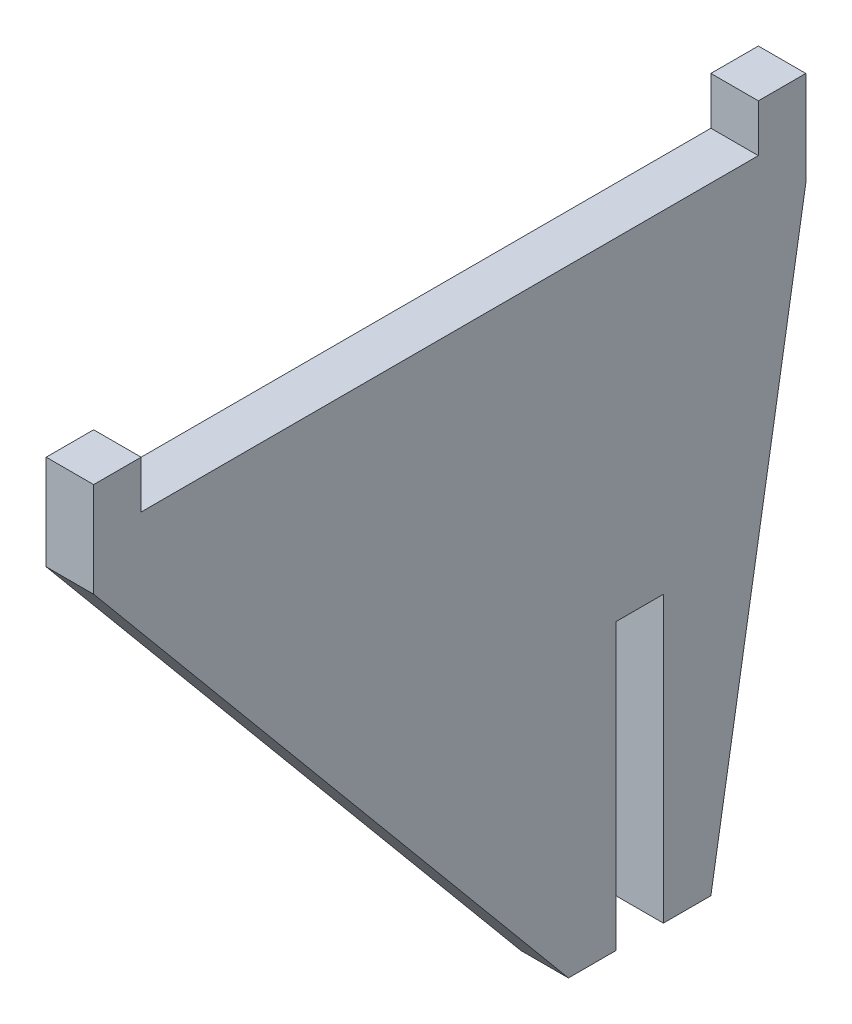
ISO-10303-21;
HEADER;
FILE_DESCRIPTION(('STEP AP214'),'2;1');
FILE_NAME('part.step','',(''),(''),'','','');
FILE_SCHEMA(('AUTOMOTIVE_DESIGN { 1 0 10303 214 1 1 1 1 }'));
ENDSEC;
DATA;
#1=APPLICATION_CONTEXT('core data for automotive mechanical design processes');
#2=APPLICATION_PROTOCOL_DEFINITION('international standard','automotive_design',2000,#1);
#3=PRODUCT_CONTEXT('',#1,'mechanical');
#4=PRODUCT('Part','Part','',(#3));
#5=PRODUCT_RELATED_PRODUCT_CATEGORY('part','',(#4));
#6=PRODUCT_DEFINITION_FORMATION('','',#4);
#7=PRODUCT_DEFINITION_CONTEXT('part definition',#1,'design');
#8=PRODUCT_DEFINITION('design','',#6,#7);
#9=PRODUCT_DEFINITION_SHAPE('','',#8);
#10=(LENGTH_UNIT() NAMED_UNIT(*) SI_UNIT(.MILLI.,.METRE.));
#11=(NAMED_UNIT(*) PLANE_ANGLE_UNIT() SI_UNIT($,.RADIAN.));
#12=(NAMED_UNIT(*) SI_UNIT($,.STERADIAN.) SOLID_ANGLE_UNIT());
#13=UNCERTAINTY_MEASURE_WITH_UNIT(LENGTH_MEASURE(1.E-05),#10,'distance_accuracy_value','');
#14=(GEOMETRIC_REPRESENTATION_CONTEXT(3) GLOBAL_UNCERTAINTY_ASSIGNED_CONTEXT((#13)) GLOBAL_UNIT_ASSIGNED_CONTEXT((#10,
#11,#12)) REPRESENTATION_CONTEXT('',''));
#15=CARTESIAN_POINT('',(0.,0.,0.));
#16=DIRECTION('',(0.,0.,1.));
#17=DIRECTION('',(1.,0.,0.));
#18=AXIS2_PLACEMENT_3D('',#15,#16,#17);
#19=CARTESIAN_POINT('',(-148.470606325174,596.899999999999,799.611357683752));
#20=DIRECTION('',(0.,0.,-1.));
#21=DIRECTION('',(-1.,0.,0.));
#22=AXIS2_PLACEMENT_3D('',#19,#20,#21);
#23=PLANE('',#22);
#24=DIRECTION('',(0.,-1.,0.));
#25=VECTOR('',#24,1.);
#26=CARTESIAN_POINT('',(-161.170606325166,596.899999999999,799.611357683752));
#27=LINE('',#26,#25);
#28=CARTESIAN_POINT('',(-161.170606325166,609.599999999999,799.611357683752));
#29=VERTEX_POINT('',#28);
#30=CARTESIAN_POINT('',(-161.170606325166,584.200000000007,799.611357683752));
#31=VERTEX_POINT('',#30);
#32=EDGE_CURVE('E111',#29,#31,#27,.T.);
#33=ORIENTED_EDGE('',*,*,#32,.T.);
#34=DIRECTION('',(-1.,0.,0.));
#35=VECTOR('',#34,1.);
#36=CARTESIAN_POINT('',(-148.470606325174,584.200000000007,799.611357683752));
#37=LINE('',#36,#35);
#38=CARTESIAN_POINT('',(-148.470606325174,584.200000000007,799.611357683752));
#39=VERTEX_POINT('',#38);
#40=EDGE_CURVE('E11',#39,#31,#37,.T.);
#41=ORIENTED_EDGE('',*,*,#40,.F.);
#42=DIRECTION('',(0.,-1.,0.));
#43=VECTOR('',#42,1.);
#44=CARTESIAN_POINT('',(-148.470606325174,609.599999999999,799.611357683752));
#45=LINE('',#44,#43);
#46=CARTESIAN_POINT('',(-148.470606325174,609.599999999999,799.611357683752));
#47=VERTEX_POINT('',#46);
#48=EDGE_CURVE('E117',#47,#39,#45,.T.);
#49=ORIENTED_EDGE('',*,*,#48,.F.);
#50=DIRECTION('',(-1.,0.,0.));
#51=VECTOR('',#50,1.);
#52=CARTESIAN_POINT('',(-148.470606325174,609.599999999999,799.611357683752));
#53=LINE('',#52,#51);
#54=EDGE_CURVE('E169',#47,#29,#53,.T.);
#55=ORIENTED_EDGE('',*,*,#54,.T.);
#56=EDGE_LOOP('',(#33,#41,#49,#55));
#57=FACE_BOUND('',#56,.T.);
#58=ADVANCED_FACE('F41',(#57),#23,.F.);
#59=CARTESIAN_POINT('',(-148.470606325174,431.800000000007,672.61135768373));
#60=DIRECTION('',(0.,0.640184399664544,-0.768221279597322));
#61=DIRECTION('',(0.,0.768221279597322,0.640184399664544));
#62=AXIS2_PLACEMENT_3D('',#59,#60,#61);
#63=PLANE('',#62);
#64=DIRECTION('',(0.,-0.768221279597322,-0.640184399664544));
#65=VECTOR('',#64,1.);
#66=CARTESIAN_POINT('',(-161.170606325166,431.800000000007,672.61135768373));
#67=LINE('',#66,#65);
#68=CARTESIAN_POINT('',(-161.170606325166,431.800000000007,672.61135768373));
#69=VERTEX_POINT('',#68);
#70=EDGE_CURVE('E174',#31,#69,#67,.T.);
#71=ORIENTED_EDGE('',*,*,#70,.T.);
#72=DIRECTION('',(-1.,0.,0.));
#73=VECTOR('',#72,1.);
#74=CARTESIAN_POINT('',(-148.470606325174,431.800000000007,672.61135768373));
#75=LINE('',#74,#73);
#76=CARTESIAN_POINT('',(-148.470606325174,431.800000000007,672.61135768373));
#77=VERTEX_POINT('',#76);
#78=EDGE_CURVE('E49',#77,#69,#75,.T.);
#79=ORIENTED_EDGE('',*,*,#78,.F.);
#80=DIRECTION('',(0.,-0.768221279597322,-0.640184399664544));
#81=VECTOR('',#80,1.);
#82=CARTESIAN_POINT('',(-148.470606325174,431.800000000007,672.61135768373));
#83=LINE('',#82,#81);
#84=EDGE_CURVE('E277',#39,#77,#83,.T.);
#85=ORIENTED_EDGE('',*,*,#84,.F.);
#86=ORIENTED_EDGE('',*,*,#40,.T.);
#87=EDGE_LOOP('',(#71,#79,#85,#86));
#88=FACE_BOUND('',#87,.T.);
#89=ADVANCED_FACE('F280',(#88),#63,.F.);
#90=CARTESIAN_POINT('',(-148.470606325174,431.800000000007,659.911357683742));
#91=DIRECTION('',(0.,1.,0.));
#92=DIRECTION('',(-1.,0.,0.));
#93=AXIS2_PLACEMENT_3D('',#90,#91,#92);
#94=PLANE('',#93);
#95=DIRECTION('',(0.,0.,-1.));
#96=VECTOR('',#95,1.);
#97=CARTESIAN_POINT('',(-161.170606325166,431.800000000007,659.911357683742));
#98=LINE('',#97,#96);
#99=CARTESIAN_POINT('',(-161.170606325166,431.800000000007,659.911357683742));
#100=VERTEX_POINT('',#99);
#101=EDGE_CURVE('E176',#69,#100,#98,.T.);
#102=ORIENTED_EDGE('',*,*,#101,.T.);
#103=DIRECTION('',(-1.,0.,0.));
#104=VECTOR('',#103,1.);
#105=CARTESIAN_POINT('',(-148.470606325174,431.800000000007,659.911357683742));
#106=LINE('',#105,#104);
#107=CARTESIAN_POINT('',(-148.470606325174,431.800000000007,659.911357683742));
#108=VERTEX_POINT('',#107);
#109=EDGE_CURVE('E224',#108,#100,#106,.T.);
#110=ORIENTED_EDGE('',*,*,#109,.F.);
#111=DIRECTION('',(0.,0.,-1.));
#112=VECTOR('',#111,1.);
#113=CARTESIAN_POINT('',(-148.470606325174,431.800000000007,659.911357683742));
#114=LINE('',#113,#112);
#115=EDGE_CURVE('E233',#77,#108,#114,.T.);
#116=ORIENTED_EDGE('',*,*,#115,.F.);
#117=ORIENTED_EDGE('',*,*,#78,.T.);
#118=EDGE_LOOP('',(#102,#110,#116,#117));
#119=FACE_BOUND('',#118,.T.);
#120=ADVANCED_FACE('F231',(#119),#94,.F.);
#121=CARTESIAN_POINT('',(-148.470606325174,508.000000000007,659.911357683742));
#122=DIRECTION('',(0.,0.,1.));
#123=DIRECTION('',(1.,0.,0.));
#124=AXIS2_PLACEMENT_3D('',#121,#122,#123);
#125=PLANE('',#124);
#126=DIRECTION('',(0.,1.,0.));
#127=VECTOR('',#126,1.);
#128=CARTESIAN_POINT('',(-161.170606325166,508.000000000007,659.911357683742));
#129=LINE('',#128,#127);
#130=CARTESIAN_POINT('',(-161.170606325166,508.000000000007,659.911357683742));
#131=VERTEX_POINT('',#130);
#132=EDGE_CURVE('E178',#100,#131,#129,.T.);
#133=ORIENTED_EDGE('',*,*,#132,.T.);
#134=DIRECTION('',(-1.,0.,0.));
#135=VECTOR('',#134,1.);
#136=CARTESIAN_POINT('',(-148.470606325174,508.000000000007,659.911357683742));
#137=LINE('',#136,#135);
#138=CARTESIAN_POINT('',(-148.470606325174,508.000000000007,659.911357683742));
#139=VERTEX_POINT('',#138);
#140=EDGE_CURVE('E221',#139,#131,#137,.T.);
#141=ORIENTED_EDGE('',*,*,#140,.F.);
#142=DIRECTION('',(0.,1.,0.));
#143=VECTOR('',#142,1.);
#144=CARTESIAN_POINT('',(-148.470606325174,508.000000000007,659.911357683742));
#145=LINE('',#144,#143);
#146=EDGE_CURVE('E251',#108,#139,#145,.T.);
#147=ORIENTED_EDGE('',*,*,#146,.F.);
#148=ORIENTED_EDGE('',*,*,#109,.T.);
#149=EDGE_LOOP('',(#133,#141,#147,#148));
#150=FACE_BOUND('',#149,.T.);
#151=ADVANCED_FACE('F242',(#150),#125,.F.);
#152=CARTESIAN_POINT('',(-148.470606325174,508.000000000007,647.211357683746));
#153=DIRECTION('',(0.,1.,0.));
#154=DIRECTION('',(-1.,0.,0.));
#155=AXIS2_PLACEMENT_3D('',#152,#153,#154);
#156=PLANE('',#155);
#157=DIRECTION('',(0.,0.,-1.));
#158=VECTOR('',#157,1.);
#159=CARTESIAN_POINT('',(-161.170606325166,508.000000000007,647.211357683746));
#160=LINE('',#159,#158);
#161=CARTESIAN_POINT('',(-161.170606325166,508.000000000007,647.211357683746));
#162=VERTEX_POINT('',#161);
#163=EDGE_CURVE('E180',#131,#162,#160,.T.);
#164=ORIENTED_EDGE('',*,*,#163,.T.);
#165=DIRECTION('',(-1.,0.,0.));
#166=VECTOR('',#165,1.);
#167=CARTESIAN_POINT('',(-148.470606325174,508.000000000007,647.211357683746));
#168=LINE('',#167,#166);
#169=CARTESIAN_POINT('',(-148.470606325174,508.000000000007,647.211357683746));
#170=VERTEX_POINT('',#169);
#171=EDGE_CURVE('E218',#170,#162,#168,.T.);
#172=ORIENTED_EDGE('',*,*,#171,.F.);
#173=DIRECTION('',(0.,0.,-1.));
#174=VECTOR('',#173,1.);
#175=CARTESIAN_POINT('',(-148.470606325174,508.000000000007,647.211357683746));
#176=LINE('',#175,#174);
#177=EDGE_CURVE('E248',#139,#170,#176,.T.);
#178=ORIENTED_EDGE('',*,*,#177,.F.);
#179=ORIENTED_EDGE('',*,*,#140,.T.);
#180=EDGE_LOOP('',(#164,#172,#178,#179));
#181=FACE_BOUND('',#180,.T.);
#182=ADVANCED_FACE('F246',(#181),#156,.F.);
#183=CARTESIAN_POINT('',(-148.470606325174,431.800000000007,647.211357683746));
#184=DIRECTION('',(0.,0.,-1.));
#185=DIRECTION('',(-1.,0.,0.));
#186=AXIS2_PLACEMENT_3D('',#183,#184,#185);
#187=PLANE('',#186);
#188=DIRECTION('',(0.,-1.,0.));
#189=VECTOR('',#188,1.);
#190=CARTESIAN_POINT('',(-161.170606325166,431.800000000007,647.211357683746));
#191=LINE('',#190,#189);
#192=CARTESIAN_POINT('',(-161.170606325166,431.800000000007,647.211357683746));
#193=VERTEX_POINT('',#192);
#194=EDGE_CURVE('E182',#162,#193,#191,.T.);
#195=ORIENTED_EDGE('',*,*,#194,.T.);
#196=DIRECTION('',(-1.,0.,0.));
#197=VECTOR('',#196,1.);
#198=CARTESIAN_POINT('',(-148.470606325174,431.800000000007,647.211357683746));
#199=LINE('',#198,#197);
#200=CARTESIAN_POINT('',(-148.470606325174,431.800000000007,647.211357683746));
#201=VERTEX_POINT('',#200);
#202=EDGE_CURVE('E215',#201,#193,#199,.T.);
#203=ORIENTED_EDGE('',*,*,#202,.F.);
#204=DIRECTION('',(0.,-1.,0.));
#205=VECTOR('',#204,1.);
#206=CARTESIAN_POINT('',(-148.470606325174,431.800000000007,647.211357683746));
#207=LINE('',#206,#205);
#208=EDGE_CURVE('E250',#170,#201,#207,.T.);
#209=ORIENTED_EDGE('',*,*,#208,.F.);
#210=ORIENTED_EDGE('',*,*,#171,.T.);
#211=EDGE_LOOP('',(#195,#203,#209,#210));
#212=FACE_BOUND('',#211,.T.);
#213=ADVANCED_FACE('F292',(#212),#187,.F.);
#214=CARTESIAN_POINT('',(-148.470606325174,431.800000000007,634.511357683753));
#215=DIRECTION('',(0.,1.,0.));
#216=DIRECTION('',(0.,0.,1.));
#217=AXIS2_PLACEMENT_3D('',#214,#215,#216);
#218=PLANE('',#217);
#219=DIRECTION('',(0.,0.,-1.));
#220=VECTOR('',#219,1.);
#221=CARTESIAN_POINT('',(-161.170606325166,431.800000000007,634.511357683753));
#222=LINE('',#221,#220);
#223=CARTESIAN_POINT('',(-161.170606325166,431.800000000007,634.511357683753));
#224=VERTEX_POINT('',#223);
#225=EDGE_CURVE('E184',#193,#224,#222,.T.);
#226=ORIENTED_EDGE('',*,*,#225,.T.);
#227=DIRECTION('',(-1.,0.,0.));
#228=VECTOR('',#227,1.);
#229=CARTESIAN_POINT('',(-148.470606325174,431.800000000007,634.511357683753));
#230=LINE('',#229,#228);
#231=CARTESIAN_POINT('',(-148.470606325174,431.800000000007,634.511357683753));
#232=VERTEX_POINT('',#231);
#233=EDGE_CURVE('E212',#232,#224,#230,.T.);
#234=ORIENTED_EDGE('',*,*,#233,.F.);
#235=DIRECTION('',(0.,0.,-1.));
#236=VECTOR('',#235,1.);
#237=CARTESIAN_POINT('',(-148.470606325174,431.800000000007,634.511357683753));
#238=LINE('',#237,#236);
#239=EDGE_CURVE('E253',#201,#232,#238,.T.);
#240=ORIENTED_EDGE('',*,*,#239,.F.);
#241=ORIENTED_EDGE('',*,*,#202,.T.);
#242=EDGE_LOOP('',(#226,#234,#240,#241));
#243=FACE_BOUND('',#242,.T.);
#244=ADVANCED_FACE('F295',(#243),#218,.F.);
#245=CARTESIAN_POINT('',(-148.470606325174,584.200000000007,609.11135768375));
#246=DIRECTION('',(0.,0.164398987305376,0.986393923832141));
#247=DIRECTION('',(0.,-0.986393923832141,0.164398987305376));
#248=AXIS2_PLACEMENT_3D('',#245,#246,#247);
#249=PLANE('',#248);
#250=DIRECTION('',(0.,0.986393923832141,-0.164398987305376));
#251=VECTOR('',#250,1.);
#252=CARTESIAN_POINT('',(-161.170606325166,584.200000000007,609.11135768375));
#253=LINE('',#252,#251);
#254=CARTESIAN_POINT('',(-161.170606325166,584.200000000007,609.11135768375));
#255=VERTEX_POINT('',#254);
#256=EDGE_CURVE('E186',#224,#255,#253,.T.);
#257=ORIENTED_EDGE('',*,*,#256,.T.);
#258=DIRECTION('',(-1.,0.,0.));
#259=VECTOR('',#258,1.);
#260=CARTESIAN_POINT('',(-148.470606325174,584.200000000007,609.11135768375));
#261=LINE('',#260,#259);
#262=CARTESIAN_POINT('',(-148.470606325174,584.200000000007,609.11135768375));
#263=VERTEX_POINT('',#262);
#264=EDGE_CURVE('E209',#263,#255,#261,.T.);
#265=ORIENTED_EDGE('',*,*,#264,.F.);
#266=DIRECTION('',(0.,0.986393923832141,-0.164398987305376));
#267=VECTOR('',#266,1.);
#268=CARTESIAN_POINT('',(-148.470606325174,584.200000000007,609.11135768375));
#269=LINE('',#268,#267);
#270=EDGE_CURVE('E259',#232,#263,#269,.T.);
#271=ORIENTED_EDGE('',*,*,#270,.F.);
#272=ORIENTED_EDGE('',*,*,#233,.T.);
#273=EDGE_LOOP('',(#257,#265,#271,#272));
#274=FACE_BOUND('',#273,.T.);
#275=ADVANCED_FACE('F299',(#274),#249,.F.);
#276=CARTESIAN_POINT('',(-148.470606325174,609.6,609.11135768375));
#277=DIRECTION('',(0.,0.,1.));
#278=DIRECTION('',(1.,0.,0.));
#279=AXIS2_PLACEMENT_3D('',#276,#277,#278);
#280=PLANE('',#279);
#281=DIRECTION('',(0.,1.,0.));
#282=VECTOR('',#281,1.);
#283=CARTESIAN_POINT('',(-161.170606325166,609.6,609.11135768375));
#284=LINE('',#283,#282);
#285=CARTESIAN_POINT('',(-161.170606325166,609.6,609.11135768375));
#286=VERTEX_POINT('',#285);
#287=EDGE_CURVE('E189',#255,#286,#284,.T.);
#288=ORIENTED_EDGE('',*,*,#287,.T.);
#289=DIRECTION('',(-1.,0.,0.));
#290=VECTOR('',#289,1.);
#291=CARTESIAN_POINT('',(-148.470606325174,609.6,609.11135768375));
#292=LINE('',#291,#290);
#293=CARTESIAN_POINT('',(-148.470606325174,609.6,609.11135768375));
#294=VERTEX_POINT('',#293);
#295=EDGE_CURVE('E206',#294,#286,#292,.T.);
#296=ORIENTED_EDGE('',*,*,#295,.F.);
#297=DIRECTION('',(0.,1.,0.));
#298=VECTOR('',#297,1.);
#299=CARTESIAN_POINT('',(-148.470606325174,596.9,609.11135768375));
#300=LINE('',#299,#298);
#301=EDGE_CURVE('E261',#263,#294,#300,.T.);
#302=ORIENTED_EDGE('',*,*,#301,.F.);
#303=ORIENTED_EDGE('',*,*,#264,.T.);
#304=EDGE_LOOP('',(#288,#296,#302,#303));
#305=FACE_BOUND('',#304,.T.);
#306=ADVANCED_FACE('F303',(#305),#280,.F.);
#307=CARTESIAN_POINT('',(-148.470606325174,609.599999999999,621.811357683739));
#308=DIRECTION('',(0.,-1.,0.));
#309=DIRECTION('',(0.,0.,-1.));
#310=AXIS2_PLACEMENT_3D('',#307,#308,#309);
#311=PLANE('',#310);
#312=DIRECTION('',(0.,0.,1.));
#313=VECTOR('',#312,1.);
#314=CARTESIAN_POINT('',(-161.170606325166,609.599999999999,621.811357683739));
#315=LINE('',#314,#313);
#316=CARTESIAN_POINT('',(-161.170606325166,609.599999999999,621.811357683739));
#317=VERTEX_POINT('',#316);
#318=EDGE_CURVE('E191',#286,#317,#315,.T.);
#319=ORIENTED_EDGE('',*,*,#318,.T.);
#320=DIRECTION('',(-1.,0.,0.));
#321=VECTOR('',#320,1.);
#322=CARTESIAN_POINT('',(-148.470606325174,609.599999999999,621.811357683739));
#323=LINE('',#322,#321);
#324=CARTESIAN_POINT('',(-148.470606325174,609.599999999999,621.811357683739));
#325=VERTEX_POINT('',#324);
#326=EDGE_CURVE('E203',#325,#317,#323,.T.);
#327=ORIENTED_EDGE('',*,*,#326,.F.);
#328=DIRECTION('',(0.,0.,1.));
#329=VECTOR('',#328,1.);
#330=CARTESIAN_POINT('',(-148.470606325174,609.599999999999,621.811357683739));
#331=LINE('',#330,#329);
#332=EDGE_CURVE('E263',#294,#325,#331,.T.);
#333=ORIENTED_EDGE('',*,*,#332,.F.);
#334=ORIENTED_EDGE('',*,*,#295,.T.);
#335=EDGE_LOOP('',(#319,#327,#333,#334));
#336=FACE_BOUND('',#335,.T.);
#337=ADVANCED_FACE('F269',(#336),#311,.F.);
#338=CARTESIAN_POINT('',(-148.470606325174,596.9,621.811357683739));
#339=DIRECTION('',(0.,0.,-1.));
#340=DIRECTION('',(-1.,0.,0.));
#341=AXIS2_PLACEMENT_3D('',#338,#339,#340);
#342=PLANE('',#341);
#343=DIRECTION('',(0.,-1.,0.));
#344=VECTOR('',#343,1.);
#345=CARTESIAN_POINT('',(-161.170606325166,596.9,621.811357683739));
#346=LINE('',#345,#344);
#347=CARTESIAN_POINT('',(-161.170606325166,596.9,621.811357683739));
#348=VERTEX_POINT('',#347);
#349=EDGE_CURVE('E193',#317,#348,#346,.T.);
#350=ORIENTED_EDGE('',*,*,#349,.T.);
#351=DIRECTION('',(-1.,0.,0.));
#352=VECTOR('',#351,1.);
#353=CARTESIAN_POINT('',(-148.470606325174,596.9,621.811357683739));
#354=LINE('',#353,#352);
#355=CARTESIAN_POINT('',(-148.470606325174,596.9,621.811357683739));
#356=VERTEX_POINT('',#355);
#357=EDGE_CURVE('E164',#356,#348,#354,.T.);
#358=ORIENTED_EDGE('',*,*,#357,.F.);
#359=DIRECTION('',(0.,-1.,0.));
#360=VECTOR('',#359,1.);
#361=CARTESIAN_POINT('',(-148.470606325174,596.9,621.811357683739));
#362=LINE('',#361,#360);
#363=EDGE_CURVE('E155',#325,#356,#362,.T.);
#364=ORIENTED_EDGE('',*,*,#363,.F.);
#365=ORIENTED_EDGE('',*,*,#326,.T.);
#366=EDGE_LOOP('',(#350,#358,#364,#365));
#367=FACE_BOUND('',#366,.T.);
#368=ADVANCED_FACE('F273',(#367),#342,.F.);
#369=CARTESIAN_POINT('',(-148.470606325174,596.9,786.911357683759));
#370=DIRECTION('',(0.,-1.,0.));
#371=DIRECTION('',(1.,0.,0.));
#372=AXIS2_PLACEMENT_3D('',#369,#370,#371);
#373=PLANE('',#372);
#374=DIRECTION('',(0.,0.,1.));
#375=VECTOR('',#374,1.);
#376=CARTESIAN_POINT('',(-161.170606325166,596.9,786.911357683759));
#377=LINE('',#376,#375);
#378=CARTESIAN_POINT('',(-161.170606325166,596.9,786.911357683759));
#379=VERTEX_POINT('',#378);
#380=EDGE_CURVE('E163',#348,#379,#377,.T.);
#381=ORIENTED_EDGE('',*,*,#380,.T.);
#382=DIRECTION('',(-1.,0.,0.));
#383=VECTOR('',#382,1.);
#384=CARTESIAN_POINT('',(-148.470606325174,596.9,786.911357683759));
#385=LINE('',#384,#383);
#386=CARTESIAN_POINT('',(-148.470606325174,596.9,786.911357683759));
#387=VERTEX_POINT('',#386);
#388=EDGE_CURVE('E160',#387,#379,#385,.T.);
#389=ORIENTED_EDGE('',*,*,#388,.F.);
#390=DIRECTION('',(0.,0.,1.));
#391=VECTOR('',#390,1.);
#392=CARTESIAN_POINT('',(-148.470606325174,596.9,786.911357683759));
#393=LINE('',#392,#391);
#394=EDGE_CURVE('E149',#356,#387,#393,.T.);
#395=ORIENTED_EDGE('',*,*,#394,.F.);
#396=ORIENTED_EDGE('',*,*,#357,.T.);
#397=EDGE_LOOP('',(#381,#389,#395,#396));
#398=FACE_BOUND('',#397,.T.);
#399=ADVANCED_FACE('F161',(#398),#373,.F.);
#400=CARTESIAN_POINT('',(-148.470606325174,609.599999999999,786.911357683759));
#401=DIRECTION('',(0.,0.,1.));
#402=DIRECTION('',(1.,0.,0.));
#403=AXIS2_PLACEMENT_3D('',#400,#401,#402);
#404=PLANE('',#403);
#405=DIRECTION('',(0.,1.,0.));
#406=VECTOR('',#405,1.);
#407=CARTESIAN_POINT('',(-161.170606325166,609.599999999999,786.911357683759));
#408=LINE('',#407,#406);
#409=CARTESIAN_POINT('',(-161.170606325166,609.599999999999,786.911357683759));
#410=VERTEX_POINT('',#409);
#411=EDGE_CURVE('E104',#379,#410,#408,.T.);
#412=ORIENTED_EDGE('',*,*,#411,.T.);
#413=DIRECTION('',(-1.,0.,0.));
#414=VECTOR('',#413,1.);
#415=CARTESIAN_POINT('',(-148.470606325174,609.599999999999,786.911357683759));
#416=LINE('',#415,#414);
#417=CARTESIAN_POINT('',(-148.470606325174,609.599999999999,786.911357683759));
#418=VERTEX_POINT('',#417);
#419=EDGE_CURVE('E165',#418,#410,#416,.T.);
#420=ORIENTED_EDGE('',*,*,#419,.F.);
#421=DIRECTION('',(0.,1.,0.));
#422=VECTOR('',#421,1.);
#423=CARTESIAN_POINT('',(-148.470606325174,609.599999999999,786.911357683759));
#424=LINE('',#423,#422);
#425=EDGE_CURVE('E153',#387,#418,#424,.T.);
#426=ORIENTED_EDGE('',*,*,#425,.F.);
#427=ORIENTED_EDGE('',*,*,#388,.T.);
#428=EDGE_LOOP('',(#412,#420,#426,#427));
#429=FACE_BOUND('',#428,.T.);
#430=ADVANCED_FACE('F167',(#429),#404,.F.);
#431=CARTESIAN_POINT('',(-148.470606325174,609.599999999999,799.611357683752));
#432=DIRECTION('',(0.,-1.,0.));
#433=DIRECTION('',(1.,0.,0.));
#434=AXIS2_PLACEMENT_3D('',#431,#432,#433);
#435=PLANE('',#434);
#436=DIRECTION('',(0.,0.,1.));
#437=VECTOR('',#436,1.);
#438=CARTESIAN_POINT('',(-161.170606325166,609.599999999999,799.611357683752));
#439=LINE('',#438,#437);
#440=EDGE_CURVE('E197',#410,#29,#439,.T.);
#441=ORIENTED_EDGE('',*,*,#440,.T.);
#442=ORIENTED_EDGE('',*,*,#54,.F.);
#443=DIRECTION('',(0.,0.,1.));
#444=VECTOR('',#443,1.);
#445=CARTESIAN_POINT('',(-148.470606325174,609.599999999999,799.611357683752));
#446=LINE('',#445,#444);
#447=EDGE_CURVE('E57',#418,#47,#446,.T.);
#448=ORIENTED_EDGE('',*,*,#447,.F.);
#449=ORIENTED_EDGE('',*,*,#419,.T.);
#450=EDGE_LOOP('',(#441,#442,#448,#449));
#451=FACE_BOUND('',#450,.T.);
#452=ADVANCED_FACE('F275',(#451),#435,.F.);
#453=CARTESIAN_POINT('',(-148.470606325174,0.,0.));
#454=DIRECTION('',(-1.,0.,0.));
#455=DIRECTION('',(0.,0.,1.));
#456=AXIS2_PLACEMENT_3D('',#453,#454,#455);
#457=PLANE('',#456);
#458=ORIENTED_EDGE('',*,*,#48,.T.);
#459=ORIENTED_EDGE('',*,*,#84,.T.);
#460=ORIENTED_EDGE('',*,*,#115,.T.);
#461=ORIENTED_EDGE('',*,*,#146,.T.);
#462=ORIENTED_EDGE('',*,*,#177,.T.);
#463=ORIENTED_EDGE('',*,*,#208,.T.);
#464=ORIENTED_EDGE('',*,*,#239,.T.);
#465=ORIENTED_EDGE('',*,*,#270,.T.);
#466=ORIENTED_EDGE('',*,*,#301,.T.);
#467=ORIENTED_EDGE('',*,*,#332,.T.);
#468=ORIENTED_EDGE('',*,*,#363,.T.);
#469=ORIENTED_EDGE('',*,*,#394,.T.);
#470=ORIENTED_EDGE('',*,*,#425,.T.);
#471=ORIENTED_EDGE('',*,*,#447,.T.);
#472=EDGE_LOOP('',(#458,#459,#460,#461,#462,#463,#464,#465,#466,#467,#468,#469,#470,#471));
#473=FACE_BOUND('',#472,.T.);
#474=ADVANCED_FACE('F151',(#473),#457,.F.);
#475=CARTESIAN_POINT('',(-161.170606325166,0.,0.));
#476=DIRECTION('',(-1.,0.,0.));
#477=DIRECTION('',(0.,0.,1.));
#478=AXIS2_PLACEMENT_3D('',#475,#476,#477);
#479=PLANE('',#478);
#480=ORIENTED_EDGE('',*,*,#32,.F.);
#481=ORIENTED_EDGE('',*,*,#440,.F.);
#482=ORIENTED_EDGE('',*,*,#411,.F.);
#483=ORIENTED_EDGE('',*,*,#380,.F.);
#484=ORIENTED_EDGE('',*,*,#349,.F.);
#485=ORIENTED_EDGE('',*,*,#318,.F.);
#486=ORIENTED_EDGE('',*,*,#287,.F.);
#487=ORIENTED_EDGE('',*,*,#256,.F.);
#488=ORIENTED_EDGE('',*,*,#225,.F.);
#489=ORIENTED_EDGE('',*,*,#194,.F.);
#490=ORIENTED_EDGE('',*,*,#163,.F.);
#491=ORIENTED_EDGE('',*,*,#132,.F.);
#492=ORIENTED_EDGE('',*,*,#101,.F.);
#493=ORIENTED_EDGE('',*,*,#70,.F.);
#494=EDGE_LOOP('',(#480,#481,#482,#483,#484,#485,#486,#487,#488,#489,#490,#491,#492,#493));
#495=FACE_BOUND('',#494,.T.);
#496=ADVANCED_FACE('F237',(#495),#479,.T.);
#497=CLOSED_SHELL('',(#58,#89,#120,#151,#182,#213,#244,#275,#306,#337,#368,#399,#430,#452,#474,#496));
#498=MANIFOLD_SOLID_BREP('B2',#497);
#499=ADVANCED_BREP_SHAPE_REPRESENTATION('',(#18,#498),#14);
#500=SHAPE_DEFINITION_REPRESENTATION(#9,#499);
ENDSEC;
END-ISO-10303-21;
